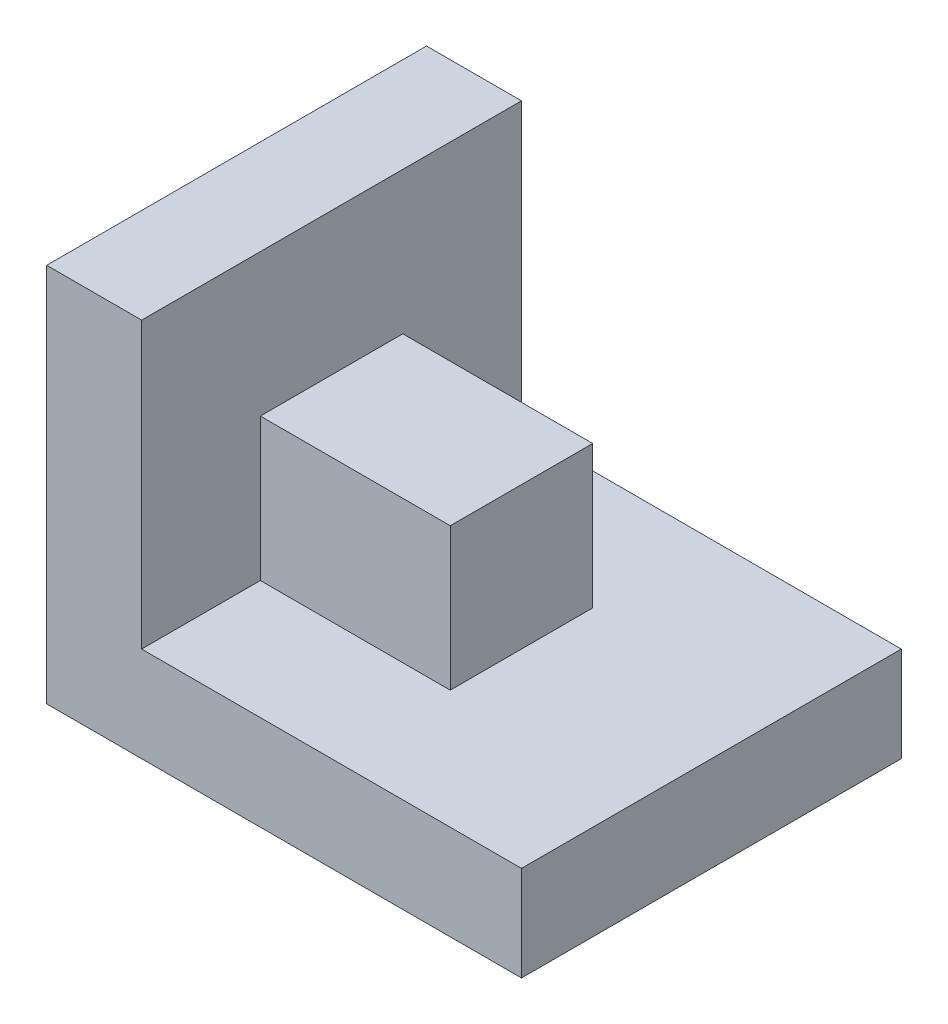
ISO-10303-21;
HEADER;
FILE_DESCRIPTION(('STEP AP214'),'2;1');
FILE_NAME('part.step','',(''),(''),'','','');
FILE_SCHEMA(('AUTOMOTIVE_DESIGN { 1 0 10303 214 1 1 1 1 }'));
ENDSEC;
DATA;
#1=APPLICATION_CONTEXT('core data for automotive mechanical design processes');
#2=APPLICATION_PROTOCOL_DEFINITION('international standard','automotive_design',2000,#1);
#3=PRODUCT_CONTEXT('',#1,'mechanical');
#4=PRODUCT('Part','Part','',(#3));
#5=PRODUCT_RELATED_PRODUCT_CATEGORY('part','',(#4));
#6=PRODUCT_DEFINITION_FORMATION('','',#4);
#7=PRODUCT_DEFINITION_CONTEXT('part definition',#1,'design');
#8=PRODUCT_DEFINITION('design','',#6,#7);
#9=PRODUCT_DEFINITION_SHAPE('','',#8);
#10=(LENGTH_UNIT() NAMED_UNIT(*) SI_UNIT(.MILLI.,.METRE.));
#11=(NAMED_UNIT(*) PLANE_ANGLE_UNIT() SI_UNIT($,.RADIAN.));
#12=(NAMED_UNIT(*) SI_UNIT($,.STERADIAN.) SOLID_ANGLE_UNIT());
#13=UNCERTAINTY_MEASURE_WITH_UNIT(LENGTH_MEASURE(1.E-05),#10,'distance_accuracy_value','');
#14=(GEOMETRIC_REPRESENTATION_CONTEXT(3) GLOBAL_UNCERTAINTY_ASSIGNED_CONTEXT((#13)) GLOBAL_UNIT_ASSIGNED_CONTEXT((#10,
#11,#12)) REPRESENTATION_CONTEXT('',''));
#15=CARTESIAN_POINT('',(0.,0.,0.));
#16=DIRECTION('',(0.,0.,1.));
#17=DIRECTION('',(1.,0.,0.));
#18=AXIS2_PLACEMENT_3D('',#15,#16,#17);
#19=CARTESIAN_POINT('',(-23.4375,-20.,40.));
#20=DIRECTION('',(-1.,0.,0.));
#21=DIRECTION('',(0.,-1.,0.));
#22=AXIS2_PLACEMENT_3D('',#19,#20,#21);
#23=PLANE('',#22);
#24=DIRECTION('',(0.,-1.,0.));
#25=VECTOR('',#24,1.);
#26=CARTESIAN_POINT('',(-23.4375,-5.,27.5));
#27=LINE('',#26,#25);
#28=CARTESIAN_POINT('',(-23.4375,-5.,27.5));
#29=VERTEX_POINT('',#28);
#30=CARTESIAN_POINT('',(-23.4375,-20.,27.5));
#31=VERTEX_POINT('',#30);
#32=EDGE_CURVE('E47',#29,#31,#27,.T.);
#33=ORIENTED_EDGE('',*,*,#32,.F.);
#34=DIRECTION('',(0.,0.,1.));
#35=VECTOR('',#34,1.);
#36=CARTESIAN_POINT('',(-23.4375,-5.,12.5));
#37=LINE('',#36,#35);
#38=CARTESIAN_POINT('',(-23.4375,-5.,12.5));
#39=VERTEX_POINT('',#38);
#40=EDGE_CURVE('E51',#39,#29,#37,.T.);
#41=ORIENTED_EDGE('',*,*,#40,.F.);
#42=DIRECTION('',(0.,1.,0.));
#43=VECTOR('',#42,1.);
#44=CARTESIAN_POINT('',(-23.4375,-5.,12.5));
#45=LINE('',#44,#43);
#46=CARTESIAN_POINT('',(-23.4375,-20.,12.5));
#47=VERTEX_POINT('',#46);
#48=EDGE_CURVE('E138',#47,#39,#45,.T.);
#49=ORIENTED_EDGE('',*,*,#48,.F.);
#50=DIRECTION('',(0.,0.,-1.));
#51=VECTOR('',#50,1.);
#52=CARTESIAN_POINT('',(-23.4375,-20.,40.));
#53=LINE('',#52,#51);
#54=CARTESIAN_POINT('',(-23.4375,-20.,0.));
#55=VERTEX_POINT('',#54);
#56=EDGE_CURVE('E114',#47,#55,#53,.T.);
#57=ORIENTED_EDGE('',*,*,#56,.T.);
#58=DIRECTION('',(0.,1.,0.));
#59=VECTOR('',#58,1.);
#60=CARTESIAN_POINT('',(-23.4375,-20.,0.));
#61=LINE('',#60,#59);
#62=CARTESIAN_POINT('',(-23.4375,10.,0.));
#63=VERTEX_POINT('',#62);
#64=EDGE_CURVE('E145',#55,#63,#61,.T.);
#65=ORIENTED_EDGE('',*,*,#64,.T.);
#66=DIRECTION('',(0.,0.,-1.));
#67=VECTOR('',#66,1.);
#68=CARTESIAN_POINT('',(-23.4375,10.,40.));
#69=LINE('',#68,#67);
#70=CARTESIAN_POINT('',(-23.4375,10.,40.));
#71=VERTEX_POINT('',#70);
#72=EDGE_CURVE('E11',#71,#63,#69,.T.);
#73=ORIENTED_EDGE('',*,*,#72,.F.);
#74=DIRECTION('',(0.,1.,0.));
#75=VECTOR('',#74,1.);
#76=CARTESIAN_POINT('',(-23.4375,-20.,40.));
#77=LINE('',#76,#75);
#78=CARTESIAN_POINT('',(-23.4375,-20.,40.));
#79=VERTEX_POINT('',#78);
#80=EDGE_CURVE('E146',#79,#71,#77,.T.);
#81=ORIENTED_EDGE('',*,*,#80,.F.);
#82=EDGE_CURVE('E171',#79,#31,#53,.T.);
#83=ORIENTED_EDGE('',*,*,#82,.T.);
#84=EDGE_LOOP('',(#33,#41,#49,#57,#65,#73,#81,#83));
#85=FACE_BOUND('',#84,.T.);
#86=ADVANCED_FACE('F33',(#85),#23,.F.);
#87=CARTESIAN_POINT('',(16.5625,-20.,40.));
#88=DIRECTION('',(0.,-1.,0.));
#89=DIRECTION('',(1.,0.,0.));
#90=AXIS2_PLACEMENT_3D('',#87,#88,#89);
#91=PLANE('',#90);
#92=DIRECTION('',(-1.,0.,0.));
#93=VECTOR('',#92,1.);
#94=CARTESIAN_POINT('',(-3.4375,-20.,27.5));
#95=LINE('',#94,#93);
#96=CARTESIAN_POINT('',(-3.4375,-20.,27.5));
#97=VERTEX_POINT('',#96);
#98=EDGE_CURVE('E117',#97,#31,#95,.T.);
#99=ORIENTED_EDGE('',*,*,#98,.T.);
#100=ORIENTED_EDGE('',*,*,#82,.F.);
#101=DIRECTION('',(-1.,0.,0.));
#102=VECTOR('',#101,1.);
#103=CARTESIAN_POINT('',(16.5625,-20.,40.));
#104=LINE('',#103,#102);
#105=CARTESIAN_POINT('',(16.5625,-20.,40.));
#106=VERTEX_POINT('',#105);
#107=EDGE_CURVE('E158',#106,#79,#104,.T.);
#108=ORIENTED_EDGE('',*,*,#107,.F.);
#109=DIRECTION('',(0.,0.,-1.));
#110=VECTOR('',#109,1.);
#111=CARTESIAN_POINT('',(16.5625,-20.,40.));
#112=LINE('',#111,#110);
#113=CARTESIAN_POINT('',(16.5625,-20.,0.));
#114=VERTEX_POINT('',#113);
#115=EDGE_CURVE('E173',#106,#114,#112,.T.);
#116=ORIENTED_EDGE('',*,*,#115,.T.);
#117=DIRECTION('',(-1.,0.,0.));
#118=VECTOR('',#117,1.);
#119=CARTESIAN_POINT('',(16.5625,-20.,0.));
#120=LINE('',#119,#118);
#121=EDGE_CURVE('E150',#114,#55,#120,.T.);
#122=ORIENTED_EDGE('',*,*,#121,.T.);
#123=ORIENTED_EDGE('',*,*,#56,.F.);
#124=DIRECTION('',(-1.,0.,0.));
#125=VECTOR('',#124,1.);
#126=CARTESIAN_POINT('',(-3.4375,-20.,12.5));
#127=LINE('',#126,#125);
#128=CARTESIAN_POINT('',(-3.4375,-20.,12.5));
#129=VERTEX_POINT('',#128);
#130=EDGE_CURVE('E108',#129,#47,#127,.T.);
#131=ORIENTED_EDGE('',*,*,#130,.F.);
#132=DIRECTION('',(0.,0.,-1.));
#133=VECTOR('',#132,1.);
#134=CARTESIAN_POINT('',(-3.4375,-20.,12.5));
#135=LINE('',#134,#133);
#136=EDGE_CURVE('E111',#97,#129,#135,.T.);
#137=ORIENTED_EDGE('',*,*,#136,.F.);
#138=EDGE_LOOP('',(#99,#100,#108,#116,#122,#123,#131,#137));
#139=FACE_BOUND('',#138,.T.);
#140=ADVANCED_FACE('F110',(#139),#91,.F.);
#141=CARTESIAN_POINT('',(-23.4375,10.,40.));
#142=DIRECTION('',(0.,-1.,0.));
#143=DIRECTION('',(0.,0.,-1.));
#144=AXIS2_PLACEMENT_3D('',#141,#142,#143);
#145=PLANE('',#144);
#146=DIRECTION('',(-1.,0.,0.));
#147=VECTOR('',#146,1.);
#148=CARTESIAN_POINT('',(-23.4375,10.,0.));
#149=LINE('',#148,#147);
#150=CARTESIAN_POINT('',(-33.4375,10.,0.));
#151=VERTEX_POINT('',#150);
#152=EDGE_CURVE('E162',#63,#151,#149,.T.);
#153=ORIENTED_EDGE('',*,*,#152,.T.);
#154=DIRECTION('',(0.,0.,-1.));
#155=VECTOR('',#154,1.);
#156=CARTESIAN_POINT('',(-33.4375,10.,40.));
#157=LINE('',#156,#155);
#158=CARTESIAN_POINT('',(-33.4375,10.,40.));
#159=VERTEX_POINT('',#158);
#160=EDGE_CURVE('E40',#159,#151,#157,.T.);
#161=ORIENTED_EDGE('',*,*,#160,.F.);
#162=DIRECTION('',(-1.,0.,0.));
#163=VECTOR('',#162,1.);
#164=CARTESIAN_POINT('',(-23.4375,10.,40.));
#165=LINE('',#164,#163);
#166=EDGE_CURVE('E149',#71,#159,#165,.T.);
#167=ORIENTED_EDGE('',*,*,#166,.F.);
#168=ORIENTED_EDGE('',*,*,#72,.T.);
#169=EDGE_LOOP('',(#153,#161,#167,#168));
#170=FACE_BOUND('',#169,.T.);
#171=ADVANCED_FACE('F209',(#170),#145,.F.);
#172=CARTESIAN_POINT('',(-33.4375,10.,40.));
#173=DIRECTION('',(1.,0.,0.));
#174=DIRECTION('',(0.,0.,-1.));
#175=AXIS2_PLACEMENT_3D('',#172,#173,#174);
#176=PLANE('',#175);
#177=DIRECTION('',(0.,-1.,0.));
#178=VECTOR('',#177,1.);
#179=CARTESIAN_POINT('',(-33.4375,10.,0.));
#180=LINE('',#179,#178);
#181=CARTESIAN_POINT('',(-33.4375,-30.,0.));
#182=VERTEX_POINT('',#181);
#183=EDGE_CURVE('E164',#151,#182,#180,.T.);
#184=ORIENTED_EDGE('',*,*,#183,.T.);
#185=DIRECTION('',(0.,0.,-1.));
#186=VECTOR('',#185,1.);
#187=CARTESIAN_POINT('',(-33.4375,-30.,40.));
#188=LINE('',#187,#186);
#189=CARTESIAN_POINT('',(-33.4375,-30.,40.));
#190=VERTEX_POINT('',#189);
#191=EDGE_CURVE('E179',#190,#182,#188,.T.);
#192=ORIENTED_EDGE('',*,*,#191,.F.);
#193=DIRECTION('',(0.,-1.,0.));
#194=VECTOR('',#193,1.);
#195=CARTESIAN_POINT('',(-33.4375,10.,40.));
#196=LINE('',#195,#194);
#197=EDGE_CURVE('E152',#159,#190,#196,.T.);
#198=ORIENTED_EDGE('',*,*,#197,.F.);
#199=ORIENTED_EDGE('',*,*,#160,.T.);
#200=EDGE_LOOP('',(#184,#192,#198,#199));
#201=FACE_BOUND('',#200,.T.);
#202=ADVANCED_FACE('F186',(#201),#176,.F.);
#203=CARTESIAN_POINT('',(-33.4375,-30.,40.));
#204=DIRECTION('',(0.,1.,0.));
#205=DIRECTION('',(0.,0.,1.));
#206=AXIS2_PLACEMENT_3D('',#203,#204,#205);
#207=PLANE('',#206);
#208=DIRECTION('',(1.,0.,0.));
#209=VECTOR('',#208,1.);
#210=CARTESIAN_POINT('',(-33.4375,-30.,0.));
#211=LINE('',#210,#209);
#212=CARTESIAN_POINT('',(16.5625,-30.,0.));
#213=VERTEX_POINT('',#212);
#214=EDGE_CURVE('E166',#182,#213,#211,.T.);
#215=ORIENTED_EDGE('',*,*,#214,.T.);
#216=DIRECTION('',(0.,0.,-1.));
#217=VECTOR('',#216,1.);
#218=CARTESIAN_POINT('',(16.5625,-30.,40.));
#219=LINE('',#218,#217);
#220=CARTESIAN_POINT('',(16.5625,-30.,40.));
#221=VERTEX_POINT('',#220);
#222=EDGE_CURVE('E176',#221,#213,#219,.T.);
#223=ORIENTED_EDGE('',*,*,#222,.F.);
#224=DIRECTION('',(1.,0.,0.));
#225=VECTOR('',#224,1.);
#226=CARTESIAN_POINT('',(-33.4375,-30.,40.));
#227=LINE('',#226,#225);
#228=EDGE_CURVE('E154',#190,#221,#227,.T.);
#229=ORIENTED_EDGE('',*,*,#228,.F.);
#230=ORIENTED_EDGE('',*,*,#191,.T.);
#231=EDGE_LOOP('',(#215,#223,#229,#230));
#232=FACE_BOUND('',#231,.T.);
#233=ADVANCED_FACE('F197',(#232),#207,.F.);
#234=CARTESIAN_POINT('',(16.5625,-30.,40.));
#235=DIRECTION('',(-1.,0.,0.));
#236=DIRECTION('',(0.,0.,1.));
#237=AXIS2_PLACEMENT_3D('',#234,#235,#236);
#238=PLANE('',#237);
#239=DIRECTION('',(0.,1.,0.));
#240=VECTOR('',#239,1.);
#241=CARTESIAN_POINT('',(16.5625,-30.,0.));
#242=LINE('',#241,#240);
#243=EDGE_CURVE('E168',#213,#114,#242,.T.);
#244=ORIENTED_EDGE('',*,*,#243,.T.);
#245=ORIENTED_EDGE('',*,*,#115,.F.);
#246=DIRECTION('',(0.,1.,0.));
#247=VECTOR('',#246,1.);
#248=CARTESIAN_POINT('',(16.5625,-30.,40.));
#249=LINE('',#248,#247);
#250=EDGE_CURVE('E156',#221,#106,#249,.T.);
#251=ORIENTED_EDGE('',*,*,#250,.F.);
#252=ORIENTED_EDGE('',*,*,#222,.T.);
#253=EDGE_LOOP('',(#244,#245,#251,#252));
#254=FACE_BOUND('',#253,.T.);
#255=ADVANCED_FACE('F201',(#254),#238,.F.);
#256=CARTESIAN_POINT('',(0.,0.,40.));
#257=DIRECTION('',(0.,0.,1.));
#258=DIRECTION('',(1.,0.,0.));
#259=AXIS2_PLACEMENT_3D('',#256,#257,#258);
#260=PLANE('',#259);
#261=ORIENTED_EDGE('',*,*,#80,.T.);
#262=ORIENTED_EDGE('',*,*,#166,.T.);
#263=ORIENTED_EDGE('',*,*,#197,.T.);
#264=ORIENTED_EDGE('',*,*,#228,.T.);
#265=ORIENTED_EDGE('',*,*,#250,.T.);
#266=ORIENTED_EDGE('',*,*,#107,.T.);
#267=EDGE_LOOP('',(#261,#262,#263,#264,#265,#266));
#268=FACE_BOUND('',#267,.T.);
#269=ADVANCED_FACE('F205',(#268),#260,.T.);
#270=CARTESIAN_POINT('',(0.,0.,0.));
#271=DIRECTION('',(0.,0.,1.));
#272=DIRECTION('',(1.,0.,0.));
#273=AXIS2_PLACEMENT_3D('',#270,#271,#272);
#274=PLANE('',#273);
#275=ORIENTED_EDGE('',*,*,#64,.F.);
#276=ORIENTED_EDGE('',*,*,#121,.F.);
#277=ORIENTED_EDGE('',*,*,#243,.F.);
#278=ORIENTED_EDGE('',*,*,#214,.F.);
#279=ORIENTED_EDGE('',*,*,#183,.F.);
#280=ORIENTED_EDGE('',*,*,#152,.F.);
#281=EDGE_LOOP('',(#275,#276,#277,#278,#279,#280));
#282=FACE_BOUND('',#281,.T.);
#283=ADVANCED_FACE('F192',(#282),#274,.F.);
#284=CARTESIAN_POINT('',(-3.43749999999999,-5.,27.5));
#285=DIRECTION('',(0.,0.,-1.));
#286=DIRECTION('',(0.,1.,0.));
#287=AXIS2_PLACEMENT_3D('',#284,#285,#286);
#288=PLANE('',#287);
#289=ORIENTED_EDGE('',*,*,#32,.T.);
#290=ORIENTED_EDGE('',*,*,#98,.F.);
#291=DIRECTION('',(0.,-1.,0.));
#292=VECTOR('',#291,1.);
#293=CARTESIAN_POINT('',(-3.43749999999999,-5.,27.5));
#294=LINE('',#293,#292);
#295=CARTESIAN_POINT('',(-3.43749999999999,-5.,27.5));
#296=VERTEX_POINT('',#295);
#297=EDGE_CURVE('E125',#296,#97,#294,.T.);
#298=ORIENTED_EDGE('',*,*,#297,.F.);
#299=DIRECTION('',(-1.,0.,0.));
#300=VECTOR('',#299,1.);
#301=CARTESIAN_POINT('',(-3.43749999999999,-5.,27.5));
#302=LINE('',#301,#300);
#303=EDGE_CURVE('E133',#296,#29,#302,.T.);
#304=ORIENTED_EDGE('',*,*,#303,.T.);
#305=EDGE_LOOP('',(#289,#290,#298,#304));
#306=FACE_BOUND('',#305,.T.);
#307=ADVANCED_FACE('F211',(#306),#288,.F.);
#308=CARTESIAN_POINT('',(-3.43749999999999,-5.,12.5));
#309=DIRECTION('',(0.,0.,1.));
#310=DIRECTION('',(0.,-1.,0.));
#311=AXIS2_PLACEMENT_3D('',#308,#309,#310);
#312=PLANE('',#311);
#313=ORIENTED_EDGE('',*,*,#48,.T.);
#314=DIRECTION('',(-1.,0.,0.));
#315=VECTOR('',#314,1.);
#316=CARTESIAN_POINT('',(-3.43749999999999,-5.,12.5));
#317=LINE('',#316,#315);
#318=CARTESIAN_POINT('',(-3.43749999999999,-5.,12.5));
#319=VERTEX_POINT('',#318);
#320=EDGE_CURVE('E118',#319,#39,#317,.T.);
#321=ORIENTED_EDGE('',*,*,#320,.F.);
#322=DIRECTION('',(0.,1.,0.));
#323=VECTOR('',#322,1.);
#324=CARTESIAN_POINT('',(-3.43749999999999,-5.,12.5));
#325=LINE('',#324,#323);
#326=EDGE_CURVE('E122',#129,#319,#325,.T.);
#327=ORIENTED_EDGE('',*,*,#326,.F.);
#328=ORIENTED_EDGE('',*,*,#130,.T.);
#329=EDGE_LOOP('',(#313,#321,#327,#328));
#330=FACE_BOUND('',#329,.T.);
#331=ADVANCED_FACE('F128',(#330),#312,.F.);
#332=CARTESIAN_POINT('',(-3.43749999999999,-5.,12.5));
#333=DIRECTION('',(0.,-1.,0.));
#334=DIRECTION('',(0.,0.,-1.));
#335=AXIS2_PLACEMENT_3D('',#332,#333,#334);
#336=PLANE('',#335);
#337=ORIENTED_EDGE('',*,*,#40,.T.);
#338=ORIENTED_EDGE('',*,*,#303,.F.);
#339=DIRECTION('',(0.,0.,1.));
#340=VECTOR('',#339,1.);
#341=CARTESIAN_POINT('',(-3.43749999999999,-5.,12.5));
#342=LINE('',#341,#340);
#343=EDGE_CURVE('E131',#319,#296,#342,.T.);
#344=ORIENTED_EDGE('',*,*,#343,.F.);
#345=ORIENTED_EDGE('',*,*,#320,.T.);
#346=EDGE_LOOP('',(#337,#338,#344,#345));
#347=FACE_BOUND('',#346,.T.);
#348=ADVANCED_FACE('F214',(#347),#336,.F.);
#349=CARTESIAN_POINT('',(-3.43749999999999,0.,0.));
#350=DIRECTION('',(-1.,0.,0.));
#351=DIRECTION('',(0.,-1.,0.));
#352=AXIS2_PLACEMENT_3D('',#349,#350,#351);
#353=PLANE('',#352);
#354=ORIENTED_EDGE('',*,*,#297,.T.);
#355=ORIENTED_EDGE('',*,*,#136,.T.);
#356=ORIENTED_EDGE('',*,*,#326,.T.);
#357=ORIENTED_EDGE('',*,*,#343,.T.);
#358=EDGE_LOOP('',(#354,#355,#356,#357));
#359=FACE_BOUND('',#358,.T.);
#360=ADVANCED_FACE('F121',(#359),#353,.F.);
#361=CLOSED_SHELL('',(#86,#140,#171,#202,#233,#255,#269,#283,#307,#331,#348,#360));
#362=MANIFOLD_SOLID_BREP('B2',#361);
#363=ADVANCED_BREP_SHAPE_REPRESENTATION('',(#18,#362),#14);
#364=SHAPE_DEFINITION_REPRESENTATION(#9,#363);
ENDSEC;
END-ISO-10303-21;
